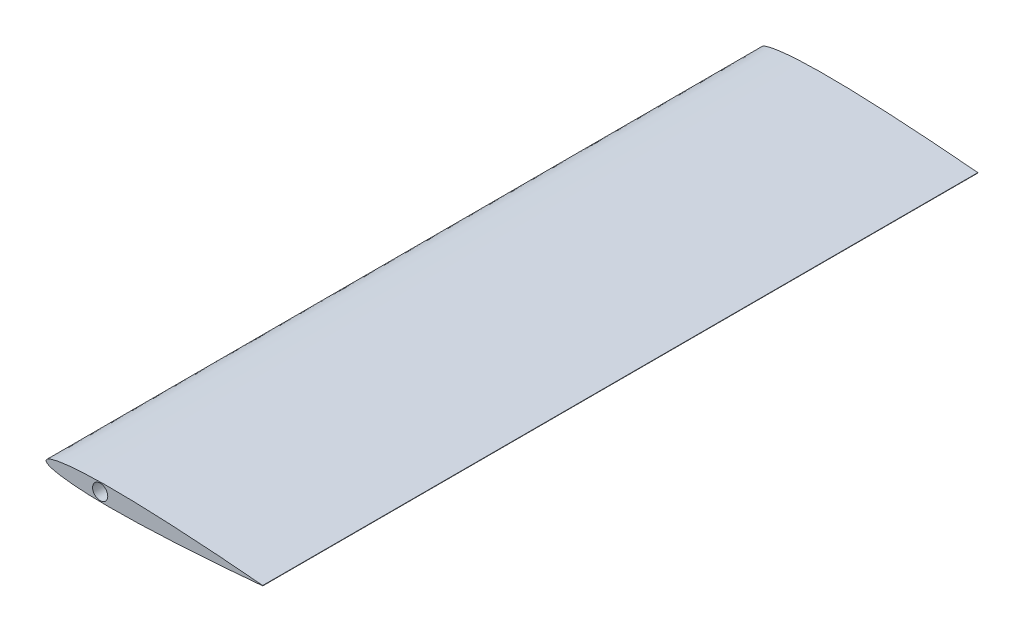
ISO-10303-21;
HEADER;
FILE_DESCRIPTION(('STEP AP214'),'2;1');
FILE_NAME('part.step','',(''),(''),'','','');
FILE_SCHEMA(('AUTOMOTIVE_DESIGN { 1 0 10303 214 1 1 1 1 }'));
ENDSEC;
DATA;
#1=APPLICATION_CONTEXT('core data for automotive mechanical design processes');
#2=APPLICATION_PROTOCOL_DEFINITION('international standard','automotive_design',2000,#1);
#3=PRODUCT_CONTEXT('',#1,'mechanical');
#4=PRODUCT('Part','Part','',(#3));
#5=PRODUCT_RELATED_PRODUCT_CATEGORY('part','',(#4));
#6=PRODUCT_DEFINITION_FORMATION('','',#4);
#7=PRODUCT_DEFINITION_CONTEXT('part definition',#1,'design');
#8=PRODUCT_DEFINITION('design','',#6,#7);
#9=PRODUCT_DEFINITION_SHAPE('','',#8);
#10=(LENGTH_UNIT() NAMED_UNIT(*) SI_UNIT(.MILLI.,.METRE.));
#11=(NAMED_UNIT(*) PLANE_ANGLE_UNIT() SI_UNIT($,.RADIAN.));
#12=(NAMED_UNIT(*) SI_UNIT($,.STERADIAN.) SOLID_ANGLE_UNIT());
#13=UNCERTAINTY_MEASURE_WITH_UNIT(LENGTH_MEASURE(1.E-05),#10,'distance_accuracy_value','');
#14=(GEOMETRIC_REPRESENTATION_CONTEXT(3) GLOBAL_UNCERTAINTY_ASSIGNED_CONTEXT((#13)) GLOBAL_UNIT_ASSIGNED_CONTEXT((#10,
#11,#12)) REPRESENTATION_CONTEXT('',''));
#15=CARTESIAN_POINT('',(0.,0.,0.));
#16=DIRECTION('',(0.,0.,1.));
#17=DIRECTION('',(1.,0.,0.));
#18=AXIS2_PLACEMENT_3D('',#15,#16,#17);
#19=CARTESIAN_POINT('',(25.,0.,0.));
#20=DIRECTION('',(0.,0.,1.));
#21=DIRECTION('',(1.,0.,0.));
#22=AXIS2_PLACEMENT_3D('',#19,#20,#21);
#23=CYLINDRICAL_SURFACE('',#22,3.);
#24=CARTESIAN_POINT('',(25.,0.,0.));
#25=DIRECTION('',(0.,0.,1.));
#26=DIRECTION('',(1.,0.,0.));
#27=AXIS2_PLACEMENT_3D('',#24,#25,#26);
#28=CIRCLE('',#27,3.);
#29=CARTESIAN_POINT('',(28.,0.,0.));
#30=VERTEX_POINT('',#29);
#31=EDGE_CURVE('E69',#30,#30,#28,.T.);
#32=ORIENTED_EDGE('',*,*,#31,.F.);
#33=EDGE_LOOP('',(#32));
#34=FACE_BOUND('',#33,.T.);
#35=CARTESIAN_POINT('',(25.,0.,310.));
#36=DIRECTION('',(0.,0.,1.));
#37=DIRECTION('',(1.,0.,0.));
#38=AXIS2_PLACEMENT_3D('',#35,#36,#37);
#39=CIRCLE('',#38,3.);
#40=CARTESIAN_POINT('',(28.,0.,310.));
#41=VERTEX_POINT('',#40);
#42=EDGE_CURVE('E90',#41,#41,#39,.T.);
#43=ORIENTED_EDGE('',*,*,#42,.T.);
#44=EDGE_LOOP('',(#43));
#45=FACE_BOUND('',#44,.T.);
#46=ADVANCED_FACE('F32',(#34,#45),#23,.F.);
#47=CARTESIAN_POINT('',(100.,0.084,330.));
#48=CARTESIAN_POINT('',(98.333488814933,0.236746480055364,330.));
#49=CARTESIAN_POINT('',(95.0011947254255,0.542172688557606,330.));
#50=CARTESIAN_POINT('',(88.3355596211879,1.11089898015662,330.));
#51=CARTESIAN_POINT('',(80.0032933562199,1.76361099520967,330.));
#52=CARTESIAN_POINT('',(70.0029989334555,2.45786169254404,330.));
#53=CARTESIAN_POINT('',(60.0031046254057,3.06174772348002,330.));
#54=CARTESIAN_POINT('',(50.0030086005351,3.55213921170033,330.));
#55=CARTESIAN_POINT('',(40.0025985576922,3.90294649372571,330.));
#56=CARTESIAN_POINT('',(31.666961485844,4.02526015065941,330.));
#57=CARTESIAN_POINT('',(24.9991546003269,3.97693379087482,330.));
#58=CARTESIAN_POINT('',(19.9977755867835,3.84497639830756,330.));
#59=CARTESIAN_POINT('',(14.9933631314586,3.59248695861782,330.));
#60=CARTESIAN_POINT('',(10.8271840648808,3.23765157891607,330.));
#61=CARTESIAN_POINT('',(7.48905438800269,2.81402136675529,330.));
#62=CARTESIAN_POINT('',(4.99359465012965,2.40367305928858,330.));
#63=CARTESIAN_POINT('',(2.84962633983361,1.86792549429032,330.));
#64=CARTESIAN_POINT('',(1.16541350274339,1.32098725183071,330.));
#65=CARTESIAN_POINT('',(-0.664613784127027,0.,330.));
#66=CARTESIAN_POINT('',(1.16541350274339,-1.32098725183071,330.));
#67=CARTESIAN_POINT('',(2.84962633983362,-1.86792549429032,330.));
#68=CARTESIAN_POINT('',(4.99359465012963,-2.40367305928857,330.));
#69=CARTESIAN_POINT('',(7.48905438800269,-2.81402136675529,330.));
#70=CARTESIAN_POINT('',(10.8271840648809,-3.23765157891607,330.));
#71=CARTESIAN_POINT('',(14.9933631314586,-3.59248695861782,330.));
#72=CARTESIAN_POINT('',(19.9977755867835,-3.84497639830756,330.));
#73=CARTESIAN_POINT('',(24.9991546003269,-3.97693379087482,330.));
#74=CARTESIAN_POINT('',(31.666961485844,-4.02526015065941,330.));
#75=CARTESIAN_POINT('',(40.0025985576922,-3.90294649372571,330.));
#76=CARTESIAN_POINT('',(50.0030086005351,-3.55213921170033,330.));
#77=CARTESIAN_POINT('',(60.0031046254058,-3.06174772348002,330.));
#78=CARTESIAN_POINT('',(70.0029989334555,-2.45786169254404,330.));
#79=CARTESIAN_POINT('',(80.0032933562199,-1.76361099520967,330.));
#80=CARTESIAN_POINT('',(88.3355596211879,-1.11089898015662,330.));
#81=CARTESIAN_POINT('',(95.0011947254255,-0.542172688557605,330.));
#82=CARTESIAN_POINT('',(98.333488814933,-0.236746480055364,330.));
#83=CARTESIAN_POINT('',(100.,-0.084,330.));
#84=B_SPLINE_CURVE_WITH_KNOTS('',3,(#47,#48,#49,#50,#51,#52,#53,#54,#55,#56,#57,#58,#59,#60,#61,
#62,#63,#64,#65,#66,#67,#68,#69,#70,#71,#72,#73,#74,#75,#76,#77,#78,#79,#80,#81,#82,#83),
.UNSPECIFIED.,.F.,.F.,(4,1,1,1,1,1,1,1,1,1,1,1,1,1,1,1,1,1,1,1,1,1,1,1,1,1,1,1,1,1,1,1,1,1,4),
(0.,0.0248762929189861,0.0497417146704998,0.0994434021110951,0.149112224036195,
0.198750974066913,0.248359097492202,0.297937369716024,0.347491327096237,0.37226694027957,
0.39705092368842,0.421859474838904,0.446731345826762,0.459220451479859,0.471790601601357,
0.484560454432956,0.491195112481227,0.5,0.508804887518773,0.515439545567044,0.528209398398643,
0.540779548520141,0.553268654173238,0.578140525161096,0.60294907631158,0.62773305972043,
0.652508672903763,0.702062630283976,0.751640902507798,0.801249025933086,0.850887775963805,
0.900556597888905,0.9502582853295,0.975123707081014,1.),.UNSPECIFIED.);
#85=DIRECTION('',(0.,0.,-1.));
#86=VECTOR('',#85,1.);
#87=SURFACE_OF_LINEAR_EXTRUSION('',#84,#86);
#88=CARTESIAN_POINT('',(100.,0.084,0.));
#89=CARTESIAN_POINT('',(98.333488814933,0.236746480055364,0.));
#90=CARTESIAN_POINT('',(95.0011947254255,0.542172688557606,0.));
#91=CARTESIAN_POINT('',(88.3355596211879,1.11089898015662,0.));
#92=CARTESIAN_POINT('',(80.0032933562199,1.76361099520967,0.));
#93=CARTESIAN_POINT('',(70.0029989334555,2.45786169254404,0.));
#94=CARTESIAN_POINT('',(60.0031046254057,3.06174772348002,0.));
#95=CARTESIAN_POINT('',(50.0030086005351,3.55213921170033,0.));
#96=CARTESIAN_POINT('',(40.0025985576922,3.90294649372571,0.));
#97=CARTESIAN_POINT('',(31.666961485844,4.02526015065941,0.));
#98=CARTESIAN_POINT('',(24.9991546003269,3.97693379087482,0.));
#99=CARTESIAN_POINT('',(19.9977755867835,3.84497639830756,0.));
#100=CARTESIAN_POINT('',(14.9933631314586,3.59248695861782,0.));
#101=CARTESIAN_POINT('',(10.8271840648808,3.23765157891607,0.));
#102=CARTESIAN_POINT('',(7.48905438800269,2.81402136675529,0.));
#103=CARTESIAN_POINT('',(4.99359465012965,2.40367305928858,0.));
#104=CARTESIAN_POINT('',(2.84962633983361,1.86792549429032,0.));
#105=CARTESIAN_POINT('',(1.16541350274339,1.32098725183071,0.));
#106=CARTESIAN_POINT('',(-0.664613784127027,0.,0.));
#107=CARTESIAN_POINT('',(1.16541350274339,-1.32098725183071,0.));
#108=CARTESIAN_POINT('',(2.84962633983362,-1.86792549429032,0.));
#109=CARTESIAN_POINT('',(4.99359465012963,-2.40367305928857,0.));
#110=CARTESIAN_POINT('',(7.48905438800269,-2.81402136675529,0.));
#111=CARTESIAN_POINT('',(10.8271840648809,-3.23765157891607,0.));
#112=CARTESIAN_POINT('',(14.9933631314586,-3.59248695861782,0.));
#113=CARTESIAN_POINT('',(19.9977755867835,-3.84497639830756,0.));
#114=CARTESIAN_POINT('',(24.9991546003269,-3.97693379087482,0.));
#115=CARTESIAN_POINT('',(31.666961485844,-4.02526015065941,0.));
#116=CARTESIAN_POINT('',(40.0025985576922,-3.90294649372571,0.));
#117=CARTESIAN_POINT('',(50.0030086005351,-3.55213921170033,0.));
#118=CARTESIAN_POINT('',(60.0031046254058,-3.06174772348002,0.));
#119=CARTESIAN_POINT('',(70.0029989334555,-2.45786169254404,0.));
#120=CARTESIAN_POINT('',(80.0032933562199,-1.76361099520967,0.));
#121=CARTESIAN_POINT('',(88.3355596211879,-1.11089898015662,0.));
#122=CARTESIAN_POINT('',(95.0011947254255,-0.542172688557605,0.));
#123=CARTESIAN_POINT('',(98.333488814933,-0.236746480055364,0.));
#124=CARTESIAN_POINT('',(100.,-0.084,0.));
#125=B_SPLINE_CURVE_WITH_KNOTS('',3,(#88,#89,#90,#91,#92,#93,#94,#95,#96,#97,#98,#99,#100,#101,
#102,#103,#104,#105,#106,#107,#108,#109,#110,#111,#112,#113,#114,#115,#116,#117,#118,#119,#120,
#121,#122,#123,#124),.UNSPECIFIED.,.F.,.F.,(4,1,1,1,1,1,1,1,1,1,1,1,1,1,1,1,1,1,1,1,1,1,1,1,1,1,
1,1,1,1,1,1,1,1,4),(0.,0.0248762929189861,0.0497417146704998,0.0994434021110951,
0.149112224036195,0.198750974066913,0.248359097492202,0.297937369716024,0.347491327096237,
0.37226694027957,0.39705092368842,0.421859474838904,0.446731345826762,0.459220451479859,
0.471790601601357,0.484560454432956,0.491195112481227,0.5,0.508804887518773,0.515439545567044,
0.528209398398643,0.540779548520141,0.553268654173238,0.578140525161096,0.60294907631158,
0.62773305972043,0.652508672903763,0.702062630283976,0.751640902507798,0.801249025933086,
0.850887775963805,0.900556597888905,0.9502582853295,0.975123707081014,1.),.UNSPECIFIED.);
#126=CARTESIAN_POINT('',(100.,0.084,0.));
#127=VERTEX_POINT('',#126);
#128=CARTESIAN_POINT('',(100.,-0.084,0.));
#129=VERTEX_POINT('',#128);
#130=EDGE_CURVE('E65',#127,#129,#125,.T.);
#131=ORIENTED_EDGE('',*,*,#130,.T.);
#132=DIRECTION('',(0.,0.,-1.));
#133=VECTOR('',#132,1.);
#134=CARTESIAN_POINT('',(100.,-0.084,330.));
#135=LINE('',#134,#133);
#136=CARTESIAN_POINT('',(100.,-0.084,330.));
#137=VERTEX_POINT('',#136);
#138=EDGE_CURVE('E11',#137,#129,#135,.T.);
#139=ORIENTED_EDGE('',*,*,#138,.F.);
#140=CARTESIAN_POINT('',(100.,0.084,330.));
#141=VERTEX_POINT('',#140);
#142=EDGE_CURVE('E64',#141,#137,#84,.T.);
#143=ORIENTED_EDGE('',*,*,#142,.F.);
#144=DIRECTION('',(0.,0.,-1.));
#145=VECTOR('',#144,1.);
#146=CARTESIAN_POINT('',(100.,0.084,330.));
#147=LINE('',#146,#145);
#148=EDGE_CURVE('E42',#141,#127,#147,.T.);
#149=ORIENTED_EDGE('',*,*,#148,.T.);
#150=EDGE_LOOP('',(#131,#139,#143,#149));
#151=FACE_BOUND('',#150,.T.);
#152=ADVANCED_FACE('F34',(#151),#87,.F.);
#153=CARTESIAN_POINT('',(99.9923008591604,0.,330.));
#154=DIRECTION('',(0.,0.,-1.));
#155=DIRECTION('',(-1.,0.,0.));
#156=AXIS2_PLACEMENT_3D('',#153,#154,#155);
#157=CYLINDRICAL_SURFACE('',#156,0.0843520999718945);
#158=CARTESIAN_POINT('',(99.9923008591604,0.,0.));
#159=DIRECTION('',(0.,0.,1.));
#160=DIRECTION('',(-1.,0.,0.));
#161=AXIS2_PLACEMENT_3D('',#158,#159,#160);
#162=CIRCLE('',#161,0.0843520999718945);
#163=EDGE_CURVE('E57',#129,#127,#162,.T.);
#164=ORIENTED_EDGE('',*,*,#163,.T.);
#165=ORIENTED_EDGE('',*,*,#148,.F.);
#166=CARTESIAN_POINT('',(99.9923008591604,0.,330.));
#167=DIRECTION('',(0.,0.,1.));
#168=DIRECTION('',(-1.,0.,0.));
#169=AXIS2_PLACEMENT_3D('',#166,#167,#168);
#170=CIRCLE('',#169,0.0843520999718945);
#171=EDGE_CURVE('E49',#137,#141,#170,.T.);
#172=ORIENTED_EDGE('',*,*,#171,.F.);
#173=ORIENTED_EDGE('',*,*,#138,.T.);
#174=EDGE_LOOP('',(#164,#165,#172,#173));
#175=FACE_BOUND('',#174,.T.);
#176=ADVANCED_FACE('F60',(#175),#157,.T.);
#177=CARTESIAN_POINT('',(0.,0.,330.));
#178=DIRECTION('',(0.,0.,-1.));
#179=DIRECTION('',(-1.,0.,0.));
#180=AXIS2_PLACEMENT_3D('',#177,#178,#179);
#181=PLANE('',#180);
#182=CARTESIAN_POINT('',(25.,0.,330.));
#183=DIRECTION('',(0.,0.,1.));
#184=DIRECTION('',(1.,0.,0.));
#185=AXIS2_PLACEMENT_3D('',#182,#183,#184);
#186=CIRCLE('',#185,3.5);
#187=CARTESIAN_POINT('',(28.5,0.,330.));
#188=VERTEX_POINT('',#187);
#189=EDGE_CURVE('E87',#188,#188,#186,.T.);
#190=ORIENTED_EDGE('',*,*,#189,.F.);
#191=EDGE_LOOP('',(#190));
#192=FACE_BOUND('',#191,.T.);
#193=ORIENTED_EDGE('',*,*,#142,.T.);
#194=ORIENTED_EDGE('',*,*,#171,.T.);
#195=EDGE_LOOP('',(#193,#194));
#196=FACE_BOUND('',#195,.T.);
#197=ADVANCED_FACE('F109',(#192,#196),#181,.F.);
#198=CARTESIAN_POINT('',(0.,0.,0.));
#199=DIRECTION('',(0.,0.,-1.));
#200=DIRECTION('',(-1.,0.,0.));
#201=AXIS2_PLACEMENT_3D('',#198,#199,#200);
#202=PLANE('',#201);
#203=ORIENTED_EDGE('',*,*,#31,.T.);
#204=EDGE_LOOP('',(#203));
#205=FACE_BOUND('',#204,.T.);
#206=ORIENTED_EDGE('',*,*,#130,.F.);
#207=ORIENTED_EDGE('',*,*,#163,.F.);
#208=EDGE_LOOP('',(#206,#207));
#209=FACE_BOUND('',#208,.T.);
#210=ADVANCED_FACE('F68',(#205,#209),#202,.T.);
#211=CARTESIAN_POINT('',(25.,0.,310.));
#212=DIRECTION('',(0.,0.,1.));
#213=DIRECTION('',(1.,0.,0.));
#214=AXIS2_PLACEMENT_3D('',#211,#212,#213);
#215=CYLINDRICAL_SURFACE('',#214,3.5);
#216=CARTESIAN_POINT('',(25.,0.,310.));
#217=DIRECTION('',(0.,0.,1.));
#218=DIRECTION('',(1.,0.,0.));
#219=AXIS2_PLACEMENT_3D('',#216,#217,#218);
#220=CIRCLE('',#219,3.5);
#221=CARTESIAN_POINT('',(28.5,0.,310.));
#222=VERTEX_POINT('',#221);
#223=EDGE_CURVE('E72',#222,#222,#220,.T.);
#224=ORIENTED_EDGE('',*,*,#223,.F.);
#225=EDGE_LOOP('',(#224));
#226=FACE_BOUND('',#225,.T.);
#227=ORIENTED_EDGE('',*,*,#189,.T.);
#228=EDGE_LOOP('',(#227));
#229=FACE_BOUND('',#228,.T.);
#230=ADVANCED_FACE('F100',(#226,#229),#215,.F.);
#231=CARTESIAN_POINT('',(25.,0.,310.));
#232=DIRECTION('',(0.,0.,1.));
#233=DIRECTION('',(1.,0.,0.));
#234=AXIS2_PLACEMENT_3D('',#231,#232,#233);
#235=PLANE('',#234);
#236=ORIENTED_EDGE('',*,*,#42,.F.);
#237=EDGE_LOOP('',(#236));
#238=FACE_BOUND('',#237,.T.);
#239=ORIENTED_EDGE('',*,*,#223,.T.);
#240=EDGE_LOOP('',(#239));
#241=FACE_BOUND('',#240,.T.);
#242=ADVANCED_FACE('F97',(#238,#241),#235,.T.);
#243=CLOSED_SHELL('',(#46,#152,#176,#197,#210,#230,#242));
#244=MANIFOLD_SOLID_BREP('B2',#243);
#245=ADVANCED_BREP_SHAPE_REPRESENTATION('',(#18,#244),#14);
#246=SHAPE_DEFINITION_REPRESENTATION(#9,#245);
ENDSEC;
END-ISO-10303-21;
